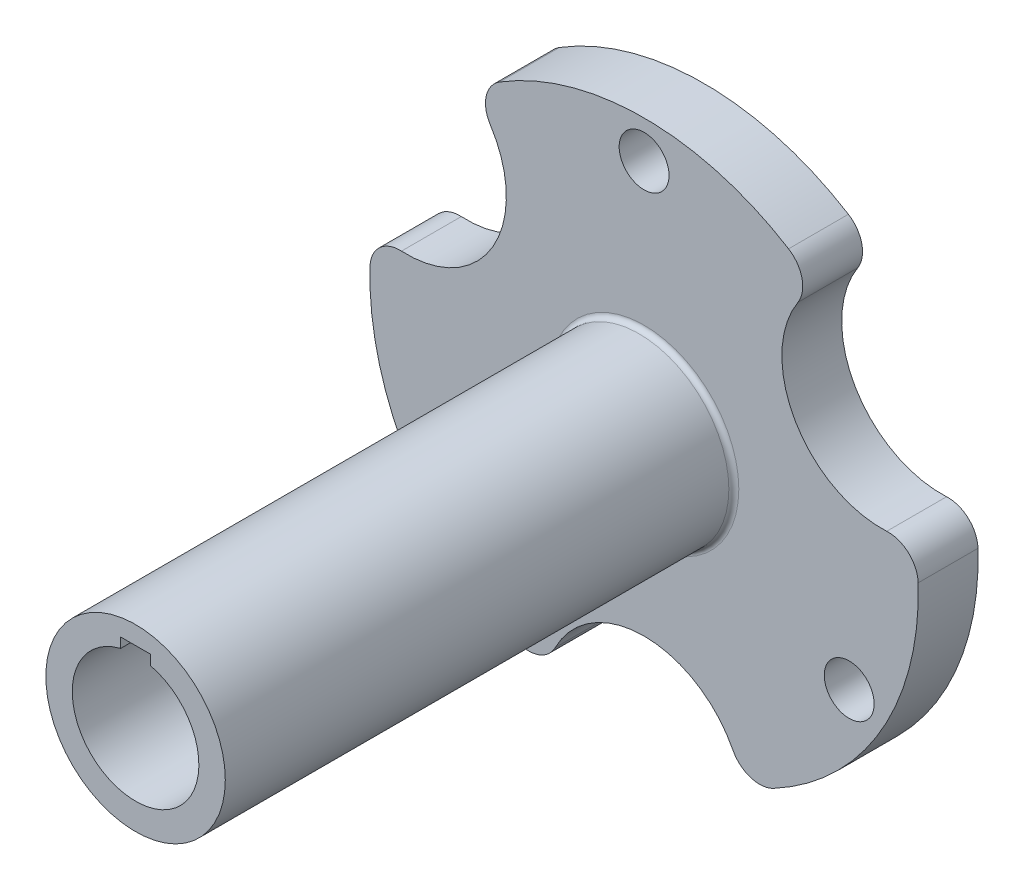
ISO-10303-21;
HEADER;
FILE_DESCRIPTION(('STEP AP214'),'2;1');
FILE_NAME('part.step','',(''),(''),'','','');
FILE_SCHEMA(('AUTOMOTIVE_DESIGN { 1 0 10303 214 1 1 1 1 }'));
ENDSEC;
DATA;
#1=APPLICATION_CONTEXT('core data for automotive mechanical design processes');
#2=APPLICATION_PROTOCOL_DEFINITION('international standard','automotive_design',2000,#1);
#3=PRODUCT_CONTEXT('',#1,'mechanical');
#4=PRODUCT('Part','Part','',(#3));
#5=PRODUCT_RELATED_PRODUCT_CATEGORY('part','',(#4));
#6=PRODUCT_DEFINITION_FORMATION('','',#4);
#7=PRODUCT_DEFINITION_CONTEXT('part definition',#1,'design');
#8=PRODUCT_DEFINITION('design','',#6,#7);
#9=PRODUCT_DEFINITION_SHAPE('','',#8);
#10=(LENGTH_UNIT() NAMED_UNIT(*) SI_UNIT(.MILLI.,.METRE.));
#11=(NAMED_UNIT(*) PLANE_ANGLE_UNIT() SI_UNIT($,.RADIAN.));
#12=(NAMED_UNIT(*) SI_UNIT($,.STERADIAN.) SOLID_ANGLE_UNIT());
#13=UNCERTAINTY_MEASURE_WITH_UNIT(LENGTH_MEASURE(1.E-05),#10,'distance_accuracy_value','');
#14=(GEOMETRIC_REPRESENTATION_CONTEXT(3) GLOBAL_UNCERTAINTY_ASSIGNED_CONTEXT((#13)) GLOBAL_UNIT_ASSIGNED_CONTEXT((#10,
#11,#12)) REPRESENTATION_CONTEXT('',''));
#15=CARTESIAN_POINT('',(0.,0.,0.));
#16=DIRECTION('',(0.,0.,1.));
#17=DIRECTION('',(1.,0.,0.));
#18=AXIS2_PLACEMENT_3D('',#15,#16,#17);
#19=CARTESIAN_POINT('',(0.,0.,6.));
#20=DIRECTION('',(0.,0.,-1.));
#21=DIRECTION('',(-1.,0.,0.));
#22=AXIS2_PLACEMENT_3D('',#19,#20,#21);
#23=CYLINDRICAL_SURFACE('',#22,6.35);
#24=CARTESIAN_POINT('',(0.,0.,0.));
#25=DIRECTION('',(0.,0.,1.));
#26=DIRECTION('',(1.,0.,0.));
#27=AXIS2_PLACEMENT_3D('',#24,#25,#26);
#28=CIRCLE('',#27,6.35);
#29=CARTESIAN_POINT('',(6.35,0.,0.));
#30=VERTEX_POINT('',#29);
#31=EDGE_CURVE('E182',#30,#30,#28,.T.);
#32=ORIENTED_EDGE('',*,*,#31,.F.);
#33=EDGE_LOOP('',(#32));
#34=FACE_BOUND('',#33,.T.);
#35=CARTESIAN_POINT('',(0.,0.,12.));
#36=DIRECTION('',(0.,0.,1.));
#37=DIRECTION('',(1.,0.,0.));
#38=AXIS2_PLACEMENT_3D('',#35,#36,#37);
#39=CIRCLE('',#38,6.35);
#40=CARTESIAN_POINT('',(1.5,6.17029172730107,12.));
#41=VERTEX_POINT('',#40);
#42=CARTESIAN_POINT('',(-1.5,6.17029172730107,12.));
#43=VERTEX_POINT('',#42);
#44=EDGE_CURVE('E444',#41,#43,#39,.T.);
#45=ORIENTED_EDGE('',*,*,#44,.T.);
#46=DIRECTION('',(0.,0.,1.));
#47=VECTOR('',#46,1.);
#48=CARTESIAN_POINT('',(-1.5,6.17029172730107,12.));
#49=LINE('',#48,#47);
#50=CARTESIAN_POINT('',(-1.5,6.17029172730107,57.));
#51=VERTEX_POINT('',#50);
#52=EDGE_CURVE('E165',#43,#51,#49,.T.);
#53=ORIENTED_EDGE('',*,*,#52,.T.);
#54=CARTESIAN_POINT('',(0.,0.,57.));
#55=DIRECTION('',(0.,0.,1.));
#56=DIRECTION('',(1.,0.,0.));
#57=AXIS2_PLACEMENT_3D('',#54,#55,#56);
#58=CIRCLE('',#57,6.35);
#59=CARTESIAN_POINT('',(1.5,6.17029172730107,57.));
#60=VERTEX_POINT('',#59);
#61=EDGE_CURVE('E171',#51,#60,#58,.T.);
#62=ORIENTED_EDGE('',*,*,#61,.T.);
#63=DIRECTION('',(0.,0.,1.));
#64=VECTOR('',#63,1.);
#65=CARTESIAN_POINT('',(1.5,6.17029172730107,12.));
#66=LINE('',#65,#64);
#67=EDGE_CURVE('E47',#41,#60,#66,.T.);
#68=ORIENTED_EDGE('',*,*,#67,.F.);
#69=EDGE_LOOP('',(#45,#53,#62,#68));
#70=FACE_BOUND('',#69,.T.);
#71=ADVANCED_FACE('F32',(#34,#70),#23,.F.);
#72=CARTESIAN_POINT('',(0.,0.,57.));
#73=DIRECTION('',(0.,0.,1.));
#74=DIRECTION('',(1.,0.,0.));
#75=AXIS2_PLACEMENT_3D('',#72,#73,#74);
#76=PLANE('',#75);
#77=CARTESIAN_POINT('',(0.,0.,57.));
#78=DIRECTION('',(0.,0.,1.));
#79=DIRECTION('',(1.,0.,0.));
#80=AXIS2_PLACEMENT_3D('',#77,#78,#79);
#81=CIRCLE('',#80,9.);
#82=CARTESIAN_POINT('',(9.,0.,57.));
#83=VERTEX_POINT('',#82);
#84=EDGE_CURVE('E175',#83,#83,#81,.T.);
#85=ORIENTED_EDGE('',*,*,#84,.T.);
#86=EDGE_LOOP('',(#85));
#87=FACE_BOUND('',#86,.T.);
#88=ORIENTED_EDGE('',*,*,#61,.F.);
#89=DIRECTION('',(0.,1.,0.));
#90=VECTOR('',#89,1.);
#91=CARTESIAN_POINT('',(-1.5,6.17029172730107,57.));
#92=LINE('',#91,#90);
#93=CARTESIAN_POINT('',(-1.5,7.17029172730107,57.));
#94=VERTEX_POINT('',#93);
#95=EDGE_CURVE('E439',#51,#94,#92,.T.);
#96=ORIENTED_EDGE('',*,*,#95,.T.);
#97=DIRECTION('',(1.,0.,0.));
#98=VECTOR('',#97,1.);
#99=CARTESIAN_POINT('',(-1.5,7.17029172730107,57.));
#100=LINE('',#99,#98);
#101=CARTESIAN_POINT('',(1.5,7.17029172730107,57.));
#102=VERTEX_POINT('',#101);
#103=EDGE_CURVE('E170',#94,#102,#100,.T.);
#104=ORIENTED_EDGE('',*,*,#103,.T.);
#105=DIRECTION('',(0.,-1.,0.));
#106=VECTOR('',#105,1.);
#107=CARTESIAN_POINT('',(1.5,7.17029172730107,57.));
#108=LINE('',#107,#106);
#109=EDGE_CURVE('E166',#102,#60,#108,.T.);
#110=ORIENTED_EDGE('',*,*,#109,.T.);
#111=EDGE_LOOP('',(#88,#96,#104,#110));
#112=FACE_BOUND('',#111,.T.);
#113=ADVANCED_FACE('F304',(#87,#112),#76,.T.);
#114=CARTESIAN_POINT('',(11.907849302036,6.875,6.));
#115=DIRECTION('',(0.,0.,1.));
#116=DIRECTION('',(1.,0.,0.));
#117=AXIS2_PLACEMENT_3D('',#114,#115,#116);
#118=PLANE('',#117);
#119=CARTESIAN_POINT('',(0.,0.,6.));
#120=DIRECTION('',(0.,0.,1.));
#121=DIRECTION('',(1.,0.,0.));
#122=AXIS2_PLACEMENT_3D('',#119,#120,#121);
#123=CIRCLE('',#122,9.5);
#124=CARTESIAN_POINT('',(9.5,0.,6.));
#125=VERTEX_POINT('',#124);
#126=EDGE_CURVE('E11',#125,#125,#123,.F.);
#127=ORIENTED_EDGE('',*,*,#126,.T.);
#128=EDGE_LOOP('',(#127));
#129=FACE_BOUND('',#128,.T.);
#130=CARTESIAN_POINT('',(-20.5681033398804,-11.875,6.));
#131=DIRECTION('',(0.,0.,1.));
#132=DIRECTION('',(1.,0.,0.));
#133=AXIS2_PLACEMENT_3D('',#130,#131,#132);
#134=CIRCLE('',#133,2.5);
#135=CARTESIAN_POINT('',(-18.0681033398804,-11.875,6.));
#136=VERTEX_POINT('',#135);
#137=EDGE_CURVE('E192',#136,#136,#134,.T.);
#138=ORIENTED_EDGE('',*,*,#137,.F.);
#139=EDGE_LOOP('',(#138));
#140=FACE_BOUND('',#139,.T.);
#141=CARTESIAN_POINT('',(0.,-27.5,6.));
#142=DIRECTION('',(0.,0.,-1.));
#143=DIRECTION('',(1.,0.,0.));
#144=AXIS2_PLACEMENT_3D('',#141,#142,#143);
#145=CIRCLE('',#144,10.);
#146=CARTESIAN_POINT('',(-8.90723542830246,-22.9545454545455,6.));
#147=VERTEX_POINT('',#146);
#148=CARTESIAN_POINT('',(8.90723542830247,-22.9545454545455,6.));
#149=VERTEX_POINT('',#148);
#150=EDGE_CURVE('E216',#147,#149,#145,.T.);
#151=ORIENTED_EDGE('',*,*,#150,.T.);
#152=CARTESIAN_POINT('',(11.5794060567932,-21.5909090909091,6.));
#153=DIRECTION('',(0.,0.,1.));
#154=DIRECTION('',(1.,0.,0.));
#155=AXIS2_PLACEMENT_3D('',#152,#153,#154);
#156=CIRCLE('',#155,3.);
#157=CARTESIAN_POINT('',(12.9972925127271,-24.234693877551,6.));
#158=VERTEX_POINT('',#157);
#159=EDGE_CURVE('E269',#149,#158,#156,.T.);
#160=ORIENTED_EDGE('',*,*,#159,.T.);
#161=CARTESIAN_POINT('',(0.,0.,6.));
#162=DIRECTION('',(0.,0.,1.));
#163=DIRECTION('',(1.,0.,0.));
#164=AXIS2_PLACEMENT_3D('',#161,#162,#163);
#165=CIRCLE('',#164,27.5);
#166=CARTESIAN_POINT('',(27.4865068072619,0.861361442336593,6.));
#167=VERTEX_POINT('',#166);
#168=EDGE_CURVE('E219',#158,#167,#165,.T.);
#169=ORIENTED_EDGE('',*,*,#168,.T.);
#170=CARTESIAN_POINT('',(24.4879787919243,0.767394739536237,6.));
#171=DIRECTION('',(0.,0.,1.));
#172=DIRECTION('',(1.,0.,0.));
#173=AXIS2_PLACEMENT_3D('',#170,#171,#172);
#174=CIRCLE('',#173,3.);
#175=CARTESIAN_POINT('',(24.3328372101122,3.76338056887403,6.));
#176=VERTEX_POINT('',#175);
#177=EDGE_CURVE('E265',#167,#176,#174,.T.);
#178=ORIENTED_EDGE('',*,*,#177,.T.);
#179=CARTESIAN_POINT('',(23.8156986040721,13.75,6.));
#180=DIRECTION('',(0.,0.,-1.));
#181=DIRECTION('',(1.,0.,0.));
#182=AXIS2_PLACEMENT_3D('',#179,#180,#181);
#183=CIRCLE('',#182,10.);
#184=CARTESIAN_POINT('',(15.4256017818097,19.1911648856714,6.));
#185=VERTEX_POINT('',#184);
#186=EDGE_CURVE('E204',#176,#185,#183,.T.);
#187=ORIENTED_EDGE('',*,*,#186,.T.);
#188=CARTESIAN_POINT('',(12.9085727351311,20.8235143513729,6.));
#189=DIRECTION('',(0.,0.,1.));
#190=DIRECTION('',(1.,0.,0.));
#191=AXIS2_PLACEMENT_3D('',#188,#189,#190);
#192=CIRCLE('',#191,3.);
#193=CARTESIAN_POINT('',(14.4892142945349,23.3733324352144,6.));
#194=VERTEX_POINT('',#193);
#195=EDGE_CURVE('E263',#185,#194,#192,.T.);
#196=ORIENTED_EDGE('',*,*,#195,.T.);
#197=CARTESIAN_POINT('',(0.,0.,6.));
#198=DIRECTION('',(0.,0.,1.));
#199=DIRECTION('',(1.,0.,0.));
#200=AXIS2_PLACEMENT_3D('',#197,#198,#199);
#201=CIRCLE('',#200,27.5);
#202=CARTESIAN_POINT('',(-14.4892142945349,23.3733324352144,6.));
#203=VERTEX_POINT('',#202);
#204=EDGE_CURVE('E207',#194,#203,#201,.T.);
#205=ORIENTED_EDGE('',*,*,#204,.T.);
#206=CARTESIAN_POINT('',(-12.9085727351311,20.8235143513728,6.));
#207=DIRECTION('',(0.,0.,1.));
#208=DIRECTION('',(1.,0.,0.));
#209=AXIS2_PLACEMENT_3D('',#206,#207,#208);
#210=CIRCLE('',#209,3.);
#211=CARTESIAN_POINT('',(-15.4256017818098,19.1911648856714,6.));
#212=VERTEX_POINT('',#211);
#213=EDGE_CURVE('E259',#203,#212,#210,.T.);
#214=ORIENTED_EDGE('',*,*,#213,.T.);
#215=CARTESIAN_POINT('',(-23.8156986040721,13.75,6.));
#216=DIRECTION('',(0.,0.,-1.));
#217=DIRECTION('',(1.,0.,0.));
#218=AXIS2_PLACEMENT_3D('',#215,#216,#217);
#219=CIRCLE('',#218,10.);
#220=CARTESIAN_POINT('',(-24.3328372101122,3.76338056887402,6.));
#221=VERTEX_POINT('',#220);
#222=EDGE_CURVE('E211',#212,#221,#219,.T.);
#223=ORIENTED_EDGE('',*,*,#222,.T.);
#224=CARTESIAN_POINT('',(-24.4879787919243,0.767394739536223,6.));
#225=DIRECTION('',(0.,0.,1.));
#226=DIRECTION('',(1.,0.,0.));
#227=AXIS2_PLACEMENT_3D('',#224,#225,#226);
#228=CIRCLE('',#227,3.);
#229=CARTESIAN_POINT('',(-27.4865068072619,0.861361442336577,6.));
#230=VERTEX_POINT('',#229);
#231=EDGE_CURVE('E261',#221,#230,#228,.T.);
#232=ORIENTED_EDGE('',*,*,#231,.T.);
#233=CARTESIAN_POINT('',(0.,0.,6.));
#234=DIRECTION('',(0.,0.,1.));
#235=DIRECTION('',(1.,0.,0.));
#236=AXIS2_PLACEMENT_3D('',#233,#234,#235);
#237=CIRCLE('',#236,27.5);
#238=CARTESIAN_POINT('',(-12.9972925127271,-24.234693877551,6.));
#239=VERTEX_POINT('',#238);
#240=EDGE_CURVE('E214',#230,#239,#237,.T.);
#241=ORIENTED_EDGE('',*,*,#240,.T.);
#242=CARTESIAN_POINT('',(-11.5794060567932,-21.5909090909091,6.));
#243=DIRECTION('',(0.,0.,1.));
#244=DIRECTION('',(1.,0.,0.));
#245=AXIS2_PLACEMENT_3D('',#242,#243,#244);
#246=CIRCLE('',#245,3.);
#247=EDGE_CURVE('E267',#239,#147,#246,.T.);
#248=ORIENTED_EDGE('',*,*,#247,.T.);
#249=EDGE_LOOP('',(#151,#160,#169,#178,#187,#196,#205,#214,#223,#232,#241,#248));
#250=FACE_BOUND('',#249,.T.);
#251=CARTESIAN_POINT('',(0.,23.75,6.));
#252=DIRECTION('',(0.,0.,1.));
#253=DIRECTION('',(1.,0.,0.));
#254=AXIS2_PLACEMENT_3D('',#251,#252,#253);
#255=CIRCLE('',#254,2.5);
#256=CARTESIAN_POINT('',(2.5,23.75,6.));
#257=VERTEX_POINT('',#256);
#258=EDGE_CURVE('E198',#257,#257,#255,.T.);
#259=ORIENTED_EDGE('',*,*,#258,.F.);
#260=EDGE_LOOP('',(#259));
#261=FACE_BOUND('',#260,.T.);
#262=CARTESIAN_POINT('',(20.5681033398804,-11.875,6.));
#263=DIRECTION('',(0.,0.,1.));
#264=DIRECTION('',(1.,0.,0.));
#265=AXIS2_PLACEMENT_3D('',#262,#263,#264);
#266=CIRCLE('',#265,2.5);
#267=CARTESIAN_POINT('',(23.0681033398804,-11.875,6.));
#268=VERTEX_POINT('',#267);
#269=EDGE_CURVE('E186',#268,#268,#266,.T.);
#270=ORIENTED_EDGE('',*,*,#269,.F.);
#271=EDGE_LOOP('',(#270));
#272=FACE_BOUND('',#271,.T.);
#273=ADVANCED_FACE('F310',(#129,#140,#250,#261,#272),#118,.T.);
#274=CARTESIAN_POINT('',(11.907849302036,6.875,0.));
#275=DIRECTION('',(0.,0.,1.));
#276=DIRECTION('',(1.,0.,0.));
#277=AXIS2_PLACEMENT_3D('',#274,#275,#276);
#278=PLANE('',#277);
#279=CARTESIAN_POINT('',(0.,0.,0.));
#280=DIRECTION('',(0.,0.,1.));
#281=DIRECTION('',(1.,0.,0.));
#282=AXIS2_PLACEMENT_3D('',#279,#280,#281);
#283=CIRCLE('',#282,27.5);
#284=CARTESIAN_POINT('',(12.9972925127271,-24.234693877551,0.));
#285=VERTEX_POINT('',#284);
#286=CARTESIAN_POINT('',(27.4865068072619,0.861361442336593,0.));
#287=VERTEX_POINT('',#286);
#288=EDGE_CURVE('E208',#285,#287,#283,.T.);
#289=ORIENTED_EDGE('',*,*,#288,.F.);
#290=CARTESIAN_POINT('',(11.5794060567932,-21.5909090909091,0.));
#291=DIRECTION('',(0.,0.,1.));
#292=DIRECTION('',(1.,0.,0.));
#293=AXIS2_PLACEMENT_3D('',#290,#291,#292);
#294=CIRCLE('',#293,3.);
#295=CARTESIAN_POINT('',(8.90723542830247,-22.9545454545455,0.));
#296=VERTEX_POINT('',#295);
#297=EDGE_CURVE('E252',#285,#296,#294,.F.);
#298=ORIENTED_EDGE('',*,*,#297,.T.);
#299=CARTESIAN_POINT('',(0.,-27.5,0.));
#300=DIRECTION('',(0.,0.,-1.));
#301=DIRECTION('',(1.,0.,0.));
#302=AXIS2_PLACEMENT_3D('',#299,#300,#301);
#303=CIRCLE('',#302,10.);
#304=CARTESIAN_POINT('',(-8.90723542830246,-22.9545454545455,0.));
#305=VERTEX_POINT('',#304);
#306=EDGE_CURVE('E233',#305,#296,#303,.T.);
#307=ORIENTED_EDGE('',*,*,#306,.F.);
#308=CARTESIAN_POINT('',(-11.5794060567932,-21.5909090909091,0.));
#309=DIRECTION('',(0.,0.,1.));
#310=DIRECTION('',(1.,0.,0.));
#311=AXIS2_PLACEMENT_3D('',#308,#309,#310);
#312=CIRCLE('',#311,3.);
#313=CARTESIAN_POINT('',(-12.9972925127271,-24.234693877551,0.));
#314=VERTEX_POINT('',#313);
#315=EDGE_CURVE('E250',#305,#314,#312,.F.);
#316=ORIENTED_EDGE('',*,*,#315,.T.);
#317=CARTESIAN_POINT('',(0.,0.,0.));
#318=DIRECTION('',(0.,0.,1.));
#319=DIRECTION('',(1.,0.,0.));
#320=AXIS2_PLACEMENT_3D('',#317,#318,#319);
#321=CIRCLE('',#320,27.5);
#322=CARTESIAN_POINT('',(-27.4865068072619,0.861361442336577,0.));
#323=VERTEX_POINT('',#322);
#324=EDGE_CURVE('E231',#323,#314,#321,.T.);
#325=ORIENTED_EDGE('',*,*,#324,.F.);
#326=CARTESIAN_POINT('',(-24.4879787919243,0.767394739536223,0.));
#327=DIRECTION('',(0.,0.,1.));
#328=DIRECTION('',(1.,0.,0.));
#329=AXIS2_PLACEMENT_3D('',#326,#327,#328);
#330=CIRCLE('',#329,3.);
#331=CARTESIAN_POINT('',(-24.3328372101122,3.76338056887402,0.));
#332=VERTEX_POINT('',#331);
#333=EDGE_CURVE('E244',#323,#332,#330,.F.);
#334=ORIENTED_EDGE('',*,*,#333,.T.);
#335=CARTESIAN_POINT('',(-23.8156986040721,13.75,0.));
#336=DIRECTION('',(0.,0.,-1.));
#337=DIRECTION('',(1.,0.,0.));
#338=AXIS2_PLACEMENT_3D('',#335,#336,#337);
#339=CIRCLE('',#338,10.);
#340=CARTESIAN_POINT('',(-15.4256017818098,19.1911648856714,0.));
#341=VERTEX_POINT('',#340);
#342=EDGE_CURVE('E228',#341,#332,#339,.T.);
#343=ORIENTED_EDGE('',*,*,#342,.F.);
#344=CARTESIAN_POINT('',(-12.9085727351311,20.8235143513728,0.));
#345=DIRECTION('',(0.,0.,1.));
#346=DIRECTION('',(1.,0.,0.));
#347=AXIS2_PLACEMENT_3D('',#344,#345,#346);
#348=CIRCLE('',#347,3.);
#349=CARTESIAN_POINT('',(-14.4892142945349,23.3733324352144,0.));
#350=VERTEX_POINT('',#349);
#351=EDGE_CURVE('E242',#341,#350,#348,.F.);
#352=ORIENTED_EDGE('',*,*,#351,.T.);
#353=CARTESIAN_POINT('',(0.,0.,0.));
#354=DIRECTION('',(0.,0.,1.));
#355=DIRECTION('',(1.,0.,0.));
#356=AXIS2_PLACEMENT_3D('',#353,#354,#355);
#357=CIRCLE('',#356,27.5);
#358=CARTESIAN_POINT('',(14.4892142945349,23.3733324352144,0.));
#359=VERTEX_POINT('',#358);
#360=EDGE_CURVE('E225',#359,#350,#357,.T.);
#361=ORIENTED_EDGE('',*,*,#360,.F.);
#362=CARTESIAN_POINT('',(12.9085727351311,20.8235143513729,0.));
#363=DIRECTION('',(0.,0.,1.));
#364=DIRECTION('',(1.,0.,0.));
#365=AXIS2_PLACEMENT_3D('',#362,#363,#364);
#366=CIRCLE('',#365,3.);
#367=CARTESIAN_POINT('',(15.4256017818097,19.1911648856714,0.));
#368=VERTEX_POINT('',#367);
#369=EDGE_CURVE('E246',#359,#368,#366,.F.);
#370=ORIENTED_EDGE('',*,*,#369,.T.);
#371=CARTESIAN_POINT('',(23.8156986040721,13.75,0.));
#372=DIRECTION('',(0.,0.,-1.));
#373=DIRECTION('',(1.,0.,0.));
#374=AXIS2_PLACEMENT_3D('',#371,#372,#373);
#375=CIRCLE('',#374,10.);
#376=CARTESIAN_POINT('',(24.3328372101122,3.76338056887403,0.));
#377=VERTEX_POINT('',#376);
#378=EDGE_CURVE('E201',#377,#368,#375,.T.);
#379=ORIENTED_EDGE('',*,*,#378,.F.);
#380=CARTESIAN_POINT('',(24.4879787919243,0.767394739536237,0.));
#381=DIRECTION('',(0.,0.,1.));
#382=DIRECTION('',(1.,0.,0.));
#383=AXIS2_PLACEMENT_3D('',#380,#381,#382);
#384=CIRCLE('',#383,3.);
#385=EDGE_CURVE('E248',#377,#287,#384,.F.);
#386=ORIENTED_EDGE('',*,*,#385,.T.);
#387=EDGE_LOOP('',(#289,#298,#307,#316,#325,#334,#343,#352,#361,#370,#379,#386));
#388=FACE_BOUND('',#387,.T.);
#389=CARTESIAN_POINT('',(0.,23.75,0.));
#390=DIRECTION('',(0.,0.,1.));
#391=DIRECTION('',(1.,0.,0.));
#392=AXIS2_PLACEMENT_3D('',#389,#390,#391);
#393=CIRCLE('',#392,2.5);
#394=CARTESIAN_POINT('',(2.5,23.75,0.));
#395=VERTEX_POINT('',#394);
#396=EDGE_CURVE('E195',#395,#395,#393,.T.);
#397=ORIENTED_EDGE('',*,*,#396,.T.);
#398=EDGE_LOOP('',(#397));
#399=FACE_BOUND('',#398,.T.);
#400=CARTESIAN_POINT('',(-20.5681033398804,-11.875,0.));
#401=DIRECTION('',(0.,0.,1.));
#402=DIRECTION('',(1.,0.,0.));
#403=AXIS2_PLACEMENT_3D('',#400,#401,#402);
#404=CIRCLE('',#403,2.5);
#405=CARTESIAN_POINT('',(-18.0681033398804,-11.875,0.));
#406=VERTEX_POINT('',#405);
#407=EDGE_CURVE('E189',#406,#406,#404,.T.);
#408=ORIENTED_EDGE('',*,*,#407,.T.);
#409=EDGE_LOOP('',(#408));
#410=FACE_BOUND('',#409,.T.);
#411=CARTESIAN_POINT('',(20.5681033398804,-11.875,0.));
#412=DIRECTION('',(0.,0.,1.));
#413=DIRECTION('',(1.,0.,0.));
#414=AXIS2_PLACEMENT_3D('',#411,#412,#413);
#415=CIRCLE('',#414,2.5);
#416=CARTESIAN_POINT('',(23.0681033398804,-11.875,0.));
#417=VERTEX_POINT('',#416);
#418=EDGE_CURVE('E185',#417,#417,#415,.T.);
#419=ORIENTED_EDGE('',*,*,#418,.T.);
#420=EDGE_LOOP('',(#419));
#421=FACE_BOUND('',#420,.T.);
#422=ORIENTED_EDGE('',*,*,#31,.T.);
#423=EDGE_LOOP('',(#422));
#424=FACE_BOUND('',#423,.T.);
#425=ADVANCED_FACE('F332',(#388,#399,#410,#421,#424),#278,.F.);
#426=CARTESIAN_POINT('',(23.8156986040721,13.75,6.));
#427=DIRECTION('',(0.,0.,-1.));
#428=DIRECTION('',(-1.,0.,0.));
#429=AXIS2_PLACEMENT_3D('',#426,#427,#428);
#430=CYLINDRICAL_SURFACE('',#429,10.);
#431=ORIENTED_EDGE('',*,*,#186,.F.);
#432=DIRECTION('',(0.,0.,-1.));
#433=VECTOR('',#432,1.);
#434=CARTESIAN_POINT('',(24.3328372101122,3.76338056887402,6.));
#435=LINE('',#434,#433);
#436=EDGE_CURVE('E277',#176,#377,#435,.T.);
#437=ORIENTED_EDGE('',*,*,#436,.T.);
#438=ORIENTED_EDGE('',*,*,#378,.T.);
#439=DIRECTION('',(0.,0.,-1.));
#440=VECTOR('',#439,1.);
#441=CARTESIAN_POINT('',(15.4256017818097,19.1911648856714,6.));
#442=LINE('',#441,#440);
#443=EDGE_CURVE('E275',#368,#185,#442,.F.);
#444=ORIENTED_EDGE('',*,*,#443,.T.);
#445=EDGE_LOOP('',(#431,#437,#438,#444));
#446=FACE_BOUND('',#445,.T.);
#447=ADVANCED_FACE('F336',(#446),#430,.F.);
#448=CARTESIAN_POINT('',(0.,0.,6.));
#449=DIRECTION('',(0.,0.,-1.));
#450=DIRECTION('',(-1.,0.,0.));
#451=AXIS2_PLACEMENT_3D('',#448,#449,#450);
#452=CYLINDRICAL_SURFACE('',#451,27.5);
#453=ORIENTED_EDGE('',*,*,#204,.F.);
#454=DIRECTION('',(0.,0.,-1.));
#455=VECTOR('',#454,1.);
#456=CARTESIAN_POINT('',(14.4892142945349,23.3733324352144,6.));
#457=LINE('',#456,#455);
#458=EDGE_CURVE('E282',#194,#359,#457,.T.);
#459=ORIENTED_EDGE('',*,*,#458,.T.);
#460=ORIENTED_EDGE('',*,*,#360,.T.);
#461=DIRECTION('',(0.,0.,-1.));
#462=VECTOR('',#461,1.);
#463=CARTESIAN_POINT('',(-14.4892142945349,23.3733324352144,6.));
#464=LINE('',#463,#462);
#465=EDGE_CURVE('E280',#350,#203,#464,.F.);
#466=ORIENTED_EDGE('',*,*,#465,.T.);
#467=EDGE_LOOP('',(#453,#459,#460,#466));
#468=FACE_BOUND('',#467,.T.);
#469=ADVANCED_FACE('F351',(#468),#452,.T.);
#470=CARTESIAN_POINT('',(-23.8156986040721,13.75,6.));
#471=DIRECTION('',(0.,0.,-1.));
#472=DIRECTION('',(-1.,0.,0.));
#473=AXIS2_PLACEMENT_3D('',#470,#471,#472);
#474=CYLINDRICAL_SURFACE('',#473,10.);
#475=ORIENTED_EDGE('',*,*,#342,.T.);
#476=DIRECTION('',(0.,0.,-1.));
#477=VECTOR('',#476,1.);
#478=CARTESIAN_POINT('',(-24.3328372101122,3.76338056887402,6.));
#479=LINE('',#478,#477);
#480=EDGE_CURVE('E288',#332,#221,#479,.F.);
#481=ORIENTED_EDGE('',*,*,#480,.T.);
#482=ORIENTED_EDGE('',*,*,#222,.F.);
#483=DIRECTION('',(0.,0.,-1.));
#484=VECTOR('',#483,1.);
#485=CARTESIAN_POINT('',(-15.4256017818098,19.1911648856714,6.));
#486=LINE('',#485,#484);
#487=EDGE_CURVE('E285',#212,#341,#486,.T.);
#488=ORIENTED_EDGE('',*,*,#487,.T.);
#489=EDGE_LOOP('',(#475,#481,#482,#488));
#490=FACE_BOUND('',#489,.T.);
#491=ADVANCED_FACE('F348',(#490),#474,.F.);
#492=CARTESIAN_POINT('',(0.,0.,6.));
#493=DIRECTION('',(0.,0.,-1.));
#494=DIRECTION('',(-1.,0.,0.));
#495=AXIS2_PLACEMENT_3D('',#492,#493,#494);
#496=CYLINDRICAL_SURFACE('',#495,27.5);
#497=ORIENTED_EDGE('',*,*,#324,.T.);
#498=DIRECTION('',(0.,0.,-1.));
#499=VECTOR('',#498,1.);
#500=CARTESIAN_POINT('',(-12.9972925127271,-24.234693877551,6.));
#501=LINE('',#500,#499);
#502=EDGE_CURVE('E55',#314,#239,#501,.F.);
#503=ORIENTED_EDGE('',*,*,#502,.T.);
#504=ORIENTED_EDGE('',*,*,#240,.F.);
#505=DIRECTION('',(0.,0.,-1.));
#506=VECTOR('',#505,1.);
#507=CARTESIAN_POINT('',(-27.4865068072619,0.861361442336577,6.));
#508=LINE('',#507,#506);
#509=EDGE_CURVE('E271',#230,#323,#508,.T.);
#510=ORIENTED_EDGE('',*,*,#509,.T.);
#511=EDGE_LOOP('',(#497,#503,#504,#510));
#512=FACE_BOUND('',#511,.T.);
#513=ADVANCED_FACE('F344',(#512),#496,.T.);
#514=CARTESIAN_POINT('',(0.,-27.5,6.));
#515=DIRECTION('',(0.,0.,-1.));
#516=DIRECTION('',(-1.,0.,0.));
#517=AXIS2_PLACEMENT_3D('',#514,#515,#516);
#518=CYLINDRICAL_SURFACE('',#517,10.);
#519=ORIENTED_EDGE('',*,*,#306,.T.);
#520=DIRECTION('',(0.,0.,-1.));
#521=VECTOR('',#520,1.);
#522=CARTESIAN_POINT('',(8.90723542830247,-22.9545454545455,6.));
#523=LINE('',#522,#521);
#524=EDGE_CURVE('E257',#296,#149,#523,.F.);
#525=ORIENTED_EDGE('',*,*,#524,.T.);
#526=ORIENTED_EDGE('',*,*,#150,.F.);
#527=DIRECTION('',(0.,0.,-1.));
#528=VECTOR('',#527,1.);
#529=CARTESIAN_POINT('',(-8.90723542830246,-22.9545454545455,6.));
#530=LINE('',#529,#528);
#531=EDGE_CURVE('E254',#147,#305,#530,.T.);
#532=ORIENTED_EDGE('',*,*,#531,.T.);
#533=EDGE_LOOP('',(#519,#525,#526,#532));
#534=FACE_BOUND('',#533,.T.);
#535=ADVANCED_FACE('F340',(#534),#518,.F.);
#536=CARTESIAN_POINT('',(0.,0.,6.));
#537=DIRECTION('',(0.,0.,-1.));
#538=DIRECTION('',(-1.,0.,0.));
#539=AXIS2_PLACEMENT_3D('',#536,#537,#538);
#540=CYLINDRICAL_SURFACE('',#539,27.5);
#541=ORIENTED_EDGE('',*,*,#168,.F.);
#542=DIRECTION('',(0.,0.,-1.));
#543=VECTOR('',#542,1.);
#544=CARTESIAN_POINT('',(12.9972925127271,-24.234693877551,6.));
#545=LINE('',#544,#543);
#546=EDGE_CURVE('E239',#158,#285,#545,.T.);
#547=ORIENTED_EDGE('',*,*,#546,.T.);
#548=ORIENTED_EDGE('',*,*,#288,.T.);
#549=DIRECTION('',(0.,0.,-1.));
#550=VECTOR('',#549,1.);
#551=CARTESIAN_POINT('',(27.4865068072619,0.861361442336593,6.));
#552=LINE('',#551,#550);
#553=EDGE_CURVE('E222',#287,#167,#552,.F.);
#554=ORIENTED_EDGE('',*,*,#553,.T.);
#555=EDGE_LOOP('',(#541,#547,#548,#554));
#556=FACE_BOUND('',#555,.T.);
#557=ADVANCED_FACE('F328',(#556),#540,.T.);
#558=CARTESIAN_POINT('',(0.,23.75,6.));
#559=DIRECTION('',(0.,0.,-1.));
#560=DIRECTION('',(-1.,0.,0.));
#561=AXIS2_PLACEMENT_3D('',#558,#559,#560);
#562=CYLINDRICAL_SURFACE('',#561,2.5);
#563=ORIENTED_EDGE('',*,*,#258,.T.);
#564=EDGE_LOOP('',(#563));
#565=FACE_BOUND('',#564,.T.);
#566=ORIENTED_EDGE('',*,*,#396,.F.);
#567=EDGE_LOOP('',(#566));
#568=FACE_BOUND('',#567,.T.);
#569=ADVANCED_FACE('F324',(#565,#568),#562,.F.);
#570=CARTESIAN_POINT('',(-20.5681033398804,-11.875,6.));
#571=DIRECTION('',(0.,0.,-1.));
#572=DIRECTION('',(-1.,0.,0.));
#573=AXIS2_PLACEMENT_3D('',#570,#571,#572);
#574=CYLINDRICAL_SURFACE('',#573,2.5);
#575=ORIENTED_EDGE('',*,*,#137,.T.);
#576=EDGE_LOOP('',(#575));
#577=FACE_BOUND('',#576,.T.);
#578=ORIENTED_EDGE('',*,*,#407,.F.);
#579=EDGE_LOOP('',(#578));
#580=FACE_BOUND('',#579,.T.);
#581=ADVANCED_FACE('F320',(#577,#580),#574,.F.);
#582=CARTESIAN_POINT('',(20.5681033398804,-11.875,6.));
#583=DIRECTION('',(0.,0.,-1.));
#584=DIRECTION('',(-1.,0.,0.));
#585=AXIS2_PLACEMENT_3D('',#582,#583,#584);
#586=CYLINDRICAL_SURFACE('',#585,2.5);
#587=ORIENTED_EDGE('',*,*,#269,.T.);
#588=EDGE_LOOP('',(#587));
#589=FACE_BOUND('',#588,.T.);
#590=ORIENTED_EDGE('',*,*,#418,.F.);
#591=EDGE_LOOP('',(#590));
#592=FACE_BOUND('',#591,.T.);
#593=ADVANCED_FACE('F317',(#589,#592),#586,.F.);
#594=CARTESIAN_POINT('',(0.,0.,57.));
#595=DIRECTION('',(0.,0.,-1.));
#596=DIRECTION('',(-1.,0.,0.));
#597=AXIS2_PLACEMENT_3D('',#594,#595,#596);
#598=CYLINDRICAL_SURFACE('',#597,9.);
#599=CARTESIAN_POINT('',(0.,0.,6.5));
#600=DIRECTION('',(0.,0.,1.));
#601=DIRECTION('',(1.,0.,0.));
#602=AXIS2_PLACEMENT_3D('',#599,#600,#601);
#603=CIRCLE('',#602,9.);
#604=CARTESIAN_POINT('',(9.,0.,6.5));
#605=VERTEX_POINT('',#604);
#606=EDGE_CURVE('E40',#605,#605,#603,.T.);
#607=ORIENTED_EDGE('',*,*,#606,.T.);
#608=EDGE_LOOP('',(#607));
#609=FACE_BOUND('',#608,.T.);
#610=ORIENTED_EDGE('',*,*,#84,.F.);
#611=EDGE_LOOP('',(#610));
#612=FACE_BOUND('',#611,.T.);
#613=ADVANCED_FACE('F292',(#609,#612),#598,.T.);
#614=CARTESIAN_POINT('',(11.5794060567932,-21.5909090909091,6.));
#615=DIRECTION('',(0.,0.,1.));
#616=DIRECTION('',(1.,0.,0.));
#617=AXIS2_PLACEMENT_3D('',#614,#615,#616);
#618=CYLINDRICAL_SURFACE('',#617,3.);
#619=ORIENTED_EDGE('',*,*,#159,.F.);
#620=ORIENTED_EDGE('',*,*,#524,.F.);
#621=ORIENTED_EDGE('',*,*,#297,.F.);
#622=ORIENTED_EDGE('',*,*,#546,.F.);
#623=EDGE_LOOP('',(#619,#620,#621,#622));
#624=FACE_BOUND('',#623,.T.);
#625=ADVANCED_FACE('F359',(#624),#618,.T.);
#626=CARTESIAN_POINT('',(-11.5794060567932,-21.5909090909091,6.));
#627=DIRECTION('',(0.,0.,1.));
#628=DIRECTION('',(1.,0.,0.));
#629=AXIS2_PLACEMENT_3D('',#626,#627,#628);
#630=CYLINDRICAL_SURFACE('',#629,3.);
#631=ORIENTED_EDGE('',*,*,#247,.F.);
#632=ORIENTED_EDGE('',*,*,#502,.F.);
#633=ORIENTED_EDGE('',*,*,#315,.F.);
#634=ORIENTED_EDGE('',*,*,#531,.F.);
#635=EDGE_LOOP('',(#631,#632,#633,#634));
#636=FACE_BOUND('',#635,.T.);
#637=ADVANCED_FACE('F362',(#636),#630,.T.);
#638=CARTESIAN_POINT('',(24.4879787919243,0.767394739536237,6.));
#639=DIRECTION('',(0.,0.,1.));
#640=DIRECTION('',(1.,0.,0.));
#641=AXIS2_PLACEMENT_3D('',#638,#639,#640);
#642=CYLINDRICAL_SURFACE('',#641,3.);
#643=ORIENTED_EDGE('',*,*,#177,.F.);
#644=ORIENTED_EDGE('',*,*,#553,.F.);
#645=ORIENTED_EDGE('',*,*,#385,.F.);
#646=ORIENTED_EDGE('',*,*,#436,.F.);
#647=EDGE_LOOP('',(#643,#644,#645,#646));
#648=FACE_BOUND('',#647,.T.);
#649=ADVANCED_FACE('F366',(#648),#642,.T.);
#650=CARTESIAN_POINT('',(12.9085727351311,20.8235143513729,6.));
#651=DIRECTION('',(0.,0.,1.));
#652=DIRECTION('',(1.,0.,0.));
#653=AXIS2_PLACEMENT_3D('',#650,#651,#652);
#654=CYLINDRICAL_SURFACE('',#653,3.);
#655=ORIENTED_EDGE('',*,*,#195,.F.);
#656=ORIENTED_EDGE('',*,*,#443,.F.);
#657=ORIENTED_EDGE('',*,*,#369,.F.);
#658=ORIENTED_EDGE('',*,*,#458,.F.);
#659=EDGE_LOOP('',(#655,#656,#657,#658));
#660=FACE_BOUND('',#659,.T.);
#661=ADVANCED_FACE('F370',(#660),#654,.T.);
#662=CARTESIAN_POINT('',(-24.4879787919243,0.767394739536223,6.));
#663=DIRECTION('',(0.,0.,1.));
#664=DIRECTION('',(1.,0.,0.));
#665=AXIS2_PLACEMENT_3D('',#662,#663,#664);
#666=CYLINDRICAL_SURFACE('',#665,3.);
#667=ORIENTED_EDGE('',*,*,#231,.F.);
#668=ORIENTED_EDGE('',*,*,#480,.F.);
#669=ORIENTED_EDGE('',*,*,#333,.F.);
#670=ORIENTED_EDGE('',*,*,#509,.F.);
#671=EDGE_LOOP('',(#667,#668,#669,#670));
#672=FACE_BOUND('',#671,.T.);
#673=ADVANCED_FACE('F374',(#672),#666,.T.);
#674=CARTESIAN_POINT('',(-12.9085727351311,20.8235143513728,6.));
#675=DIRECTION('',(0.,0.,1.));
#676=DIRECTION('',(1.,0.,0.));
#677=AXIS2_PLACEMENT_3D('',#674,#675,#676);
#678=CYLINDRICAL_SURFACE('',#677,3.);
#679=ORIENTED_EDGE('',*,*,#213,.F.);
#680=ORIENTED_EDGE('',*,*,#465,.F.);
#681=ORIENTED_EDGE('',*,*,#351,.F.);
#682=ORIENTED_EDGE('',*,*,#487,.F.);
#683=EDGE_LOOP('',(#679,#680,#681,#682));
#684=FACE_BOUND('',#683,.T.);
#685=ADVANCED_FACE('F377',(#684),#678,.T.);
#686=CARTESIAN_POINT('',(-1.5,6.17029172730107,12.));
#687=DIRECTION('',(1.,0.,0.));
#688=DIRECTION('',(0.,1.,0.));
#689=AXIS2_PLACEMENT_3D('',#686,#687,#688);
#690=PLANE('',#689);
#691=ORIENTED_EDGE('',*,*,#95,.F.);
#692=ORIENTED_EDGE('',*,*,#52,.F.);
#693=DIRECTION('',(0.,1.,0.));
#694=VECTOR('',#693,1.);
#695=CARTESIAN_POINT('',(-1.5,6.17029172730107,12.));
#696=LINE('',#695,#694);
#697=CARTESIAN_POINT('',(-1.5,7.17029172730107,12.));
#698=VERTEX_POINT('',#697);
#699=EDGE_CURVE('E152',#43,#698,#696,.T.);
#700=ORIENTED_EDGE('',*,*,#699,.T.);
#701=DIRECTION('',(0.,0.,1.));
#702=VECTOR('',#701,1.);
#703=CARTESIAN_POINT('',(-1.5,7.17029172730107,12.));
#704=LINE('',#703,#702);
#705=EDGE_CURVE('E162',#698,#94,#704,.T.);
#706=ORIENTED_EDGE('',*,*,#705,.T.);
#707=EDGE_LOOP('',(#691,#692,#700,#706));
#708=FACE_BOUND('',#707,.T.);
#709=ADVANCED_FACE('F161',(#708),#690,.T.);
#710=CARTESIAN_POINT('',(-1.5,7.17029172730107,12.));
#711=DIRECTION('',(0.,-1.,0.));
#712=DIRECTION('',(1.,0.,0.));
#713=AXIS2_PLACEMENT_3D('',#710,#711,#712);
#714=PLANE('',#713);
#715=ORIENTED_EDGE('',*,*,#103,.F.);
#716=ORIENTED_EDGE('',*,*,#705,.F.);
#717=DIRECTION('',(1.,0.,0.));
#718=VECTOR('',#717,1.);
#719=CARTESIAN_POINT('',(-1.5,7.17029172730107,12.));
#720=LINE('',#719,#718);
#721=CARTESIAN_POINT('',(1.5,7.17029172730107,12.));
#722=VERTEX_POINT('',#721);
#723=EDGE_CURVE('E148',#698,#722,#720,.T.);
#724=ORIENTED_EDGE('',*,*,#723,.T.);
#725=DIRECTION('',(0.,0.,1.));
#726=VECTOR('',#725,1.);
#727=CARTESIAN_POINT('',(1.5,7.17029172730107,12.));
#728=LINE('',#727,#726);
#729=EDGE_CURVE('E172',#722,#102,#728,.T.);
#730=ORIENTED_EDGE('',*,*,#729,.T.);
#731=EDGE_LOOP('',(#715,#716,#724,#730));
#732=FACE_BOUND('',#731,.T.);
#733=ADVANCED_FACE('F168',(#732),#714,.T.);
#734=CARTESIAN_POINT('',(1.5,7.17029172730107,12.));
#735=DIRECTION('',(-1.,0.,0.));
#736=DIRECTION('',(0.,-1.,0.));
#737=AXIS2_PLACEMENT_3D('',#734,#735,#736);
#738=PLANE('',#737);
#739=ORIENTED_EDGE('',*,*,#109,.F.);
#740=ORIENTED_EDGE('',*,*,#729,.F.);
#741=DIRECTION('',(0.,-1.,0.));
#742=VECTOR('',#741,1.);
#743=CARTESIAN_POINT('',(1.5,7.17029172730107,12.));
#744=LINE('',#743,#742);
#745=EDGE_CURVE('E154',#722,#41,#744,.T.);
#746=ORIENTED_EDGE('',*,*,#745,.T.);
#747=ORIENTED_EDGE('',*,*,#67,.T.);
#748=EDGE_LOOP('',(#739,#740,#746,#747));
#749=FACE_BOUND('',#748,.T.);
#750=ADVANCED_FACE('F300',(#749),#738,.T.);
#751=CARTESIAN_POINT('',(0.,0.,12.));
#752=DIRECTION('',(0.,0.,1.));
#753=DIRECTION('',(1.,0.,0.));
#754=AXIS2_PLACEMENT_3D('',#751,#752,#753);
#755=PLANE('',#754);
#756=ORIENTED_EDGE('',*,*,#699,.F.);
#757=ORIENTED_EDGE('',*,*,#44,.F.);
#758=ORIENTED_EDGE('',*,*,#745,.F.);
#759=ORIENTED_EDGE('',*,*,#723,.F.);
#760=EDGE_LOOP('',(#756,#757,#758,#759));
#761=FACE_BOUND('',#760,.T.);
#762=ADVANCED_FACE('F150',(#761),#755,.T.);
#763=CARTESIAN_POINT('',(0.,0.,6.5));
#764=DIRECTION('',(0.,0.,1.));
#765=DIRECTION('',(1.,0.,0.));
#766=AXIS2_PLACEMENT_3D('',#763,#764,#765);
#767=TOROIDAL_SURFACE('',#766,9.5,0.5);
#768=ORIENTED_EDGE('',*,*,#126,.F.);
#769=EDGE_LOOP('',(#768));
#770=FACE_BOUND('',#769,.T.);
#771=ORIENTED_EDGE('',*,*,#606,.F.);
#772=EDGE_LOOP('',(#771));
#773=FACE_BOUND('',#772,.T.);
#774=ADVANCED_FACE('F34',(#770,#773),#767,.F.);
#775=CLOSED_SHELL('',(#71,#113,#273,#425,#447,#469,#491,#513,#535,#557,#569,#581,#593,#613,#625,
#637,#649,#661,#673,#685,#709,#733,#750,#762,#774));
#776=MANIFOLD_SOLID_BREP('B2',#775);
#777=ADVANCED_BREP_SHAPE_REPRESENTATION('',(#18,#776),#14);
#778=SHAPE_DEFINITION_REPRESENTATION(#9,#777);
ENDSEC;
END-ISO-10303-21;
